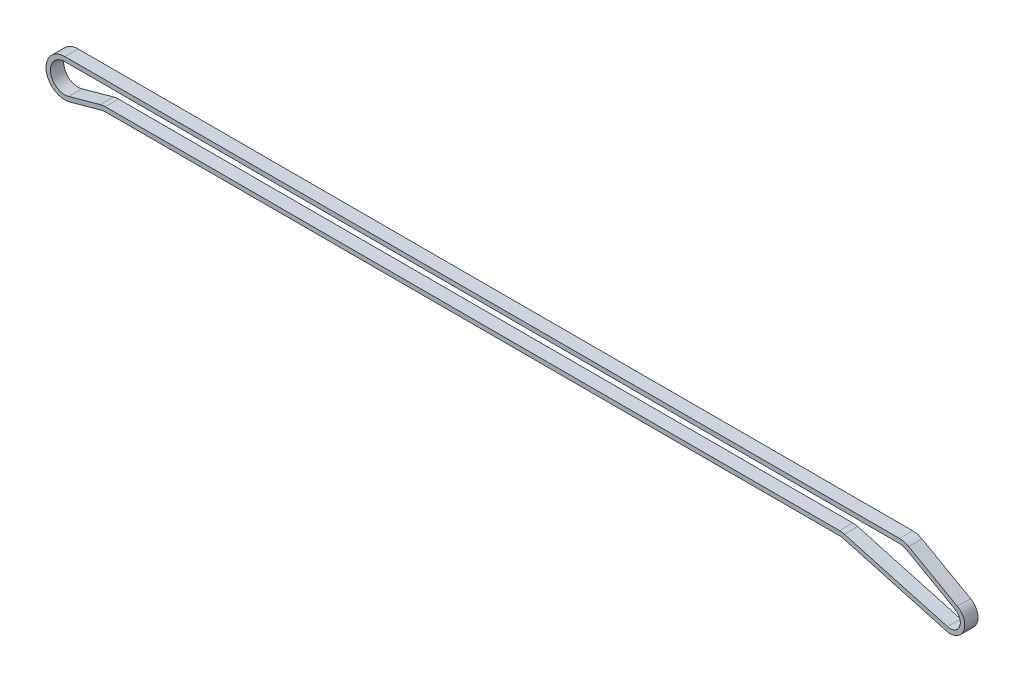
ISO-10303-21;
HEADER;
FILE_DESCRIPTION(('STEP AP214'),'2;1');
FILE_NAME('part.step','',(''),(''),'','','');
FILE_SCHEMA(('AUTOMOTIVE_DESIGN { 1 0 10303 214 1 1 1 1 }'));
ENDSEC;
DATA;
#1=APPLICATION_CONTEXT('core data for automotive mechanical design processes');
#2=APPLICATION_PROTOCOL_DEFINITION('international standard','automotive_design',2000,#1);
#3=PRODUCT_CONTEXT('',#1,'mechanical');
#4=PRODUCT('Part','Part','',(#3));
#5=PRODUCT_RELATED_PRODUCT_CATEGORY('part','',(#4));
#6=PRODUCT_DEFINITION_FORMATION('','',#4);
#7=PRODUCT_DEFINITION_CONTEXT('part definition',#1,'design');
#8=PRODUCT_DEFINITION('design','',#6,#7);
#9=PRODUCT_DEFINITION_SHAPE('','',#8);
#10=(LENGTH_UNIT() NAMED_UNIT(*) SI_UNIT(.MILLI.,.METRE.));
#11=(NAMED_UNIT(*) PLANE_ANGLE_UNIT() SI_UNIT($,.RADIAN.));
#12=(NAMED_UNIT(*) SI_UNIT($,.STERADIAN.) SOLID_ANGLE_UNIT());
#13=UNCERTAINTY_MEASURE_WITH_UNIT(LENGTH_MEASURE(1.E-05),#10,'distance_accuracy_value','');
#14=(GEOMETRIC_REPRESENTATION_CONTEXT(3) GLOBAL_UNCERTAINTY_ASSIGNED_CONTEXT((#13)) GLOBAL_UNIT_ASSIGNED_CONTEXT((#10,
#11,#12)) REPRESENTATION_CONTEXT('',''));
#15=CARTESIAN_POINT('',(0.,0.,0.));
#16=DIRECTION('',(0.,0.,1.));
#17=DIRECTION('',(1.,0.,0.));
#18=AXIS2_PLACEMENT_3D('',#15,#16,#17);
#19=CARTESIAN_POINT('',(-30.444863728675,-2.49999999999809,0.));
#20=DIRECTION('',(0.,0.,1.));
#21=DIRECTION('',(1.,0.,0.));
#22=AXIS2_PLACEMENT_3D('',#19,#20,#21);
#23=CYLINDRICAL_SURFACE('',#22,8.5);
#24=CARTESIAN_POINT('',(-30.444863728675,-2.49999999999809,6.));
#25=DIRECTION('',(0.,0.,1.));
#26=DIRECTION('',(1.,0.,0.));
#27=AXIS2_PLACEMENT_3D('',#24,#25,#26);
#28=CIRCLE('',#27,8.5);
#29=CARTESIAN_POINT('',(-30.444863728675,6.00000000000191,6.));
#30=VERTEX_POINT('',#29);
#31=CARTESIAN_POINT('',(-28.1810923233217,-10.6930054939731,6.));
#32=VERTEX_POINT('',#31);
#33=EDGE_CURVE('E236',#30,#32,#28,.T.);
#34=ORIENTED_EDGE('',*,*,#33,.F.);
#35=DIRECTION('',(0.,0.,1.));
#36=VECTOR('',#35,1.);
#37=CARTESIAN_POINT('',(-30.444863728675,6.00000000000191,0.));
#38=LINE('',#37,#36);
#39=CARTESIAN_POINT('',(-30.444863728675,6.00000000000191,0.));
#40=VERTEX_POINT('',#39);
#41=EDGE_CURVE('E11',#40,#30,#38,.T.);
#42=ORIENTED_EDGE('',*,*,#41,.F.);
#43=CARTESIAN_POINT('',(-30.444863728675,-2.49999999999809,0.));
#44=DIRECTION('',(0.,0.,1.));
#45=DIRECTION('',(1.,0.,0.));
#46=AXIS2_PLACEMENT_3D('',#43,#44,#45);
#47=CIRCLE('',#46,8.5);
#48=CARTESIAN_POINT('',(-28.1810923233217,-10.6930054939731,0.));
#49=VERTEX_POINT('',#48);
#50=EDGE_CURVE('E252',#40,#49,#47,.T.);
#51=ORIENTED_EDGE('',*,*,#50,.T.);
#52=DIRECTION('',(0.,0.,1.));
#53=VECTOR('',#52,1.);
#54=CARTESIAN_POINT('',(-28.1810923233217,-10.6930054939731,0.));
#55=LINE('',#54,#53);
#56=EDGE_CURVE('E33',#49,#32,#55,.T.);
#57=ORIENTED_EDGE('',*,*,#56,.T.);
#58=EDGE_LOOP('',(#34,#42,#51,#57));
#59=FACE_BOUND('',#58,.T.);
#60=ADVANCED_FACE('F30',(#59),#23,.T.);
#61=CARTESIAN_POINT('',(347.150669090667,6.00000000000012,0.));
#62=DIRECTION('',(0.,1.,0.));
#63=DIRECTION('',(-1.,0.,0.));
#64=AXIS2_PLACEMENT_3D('',#61,#62,#63);
#65=PLANE('',#64);
#66=DIRECTION('',(-1.,0.,0.));
#67=VECTOR('',#66,1.);
#68=CARTESIAN_POINT('',(347.150669090667,6.00000000000012,6.));
#69=LINE('',#68,#67);
#70=CARTESIAN_POINT('',(347.150669090667,6.00000000000012,6.));
#71=VERTEX_POINT('',#70);
#72=EDGE_CURVE('E256',#71,#30,#69,.T.);
#73=ORIENTED_EDGE('',*,*,#72,.F.);
#74=DIRECTION('',(0.,0.,1.));
#75=VECTOR('',#74,1.);
#76=CARTESIAN_POINT('',(347.150669090667,6.00000000000012,0.));
#77=LINE('',#76,#75);
#78=CARTESIAN_POINT('',(347.150669090667,6.00000000000012,0.));
#79=VERTEX_POINT('',#78);
#80=EDGE_CURVE('E38',#79,#71,#77,.T.);
#81=ORIENTED_EDGE('',*,*,#80,.F.);
#82=DIRECTION('',(-1.,0.,0.));
#83=VECTOR('',#82,1.);
#84=CARTESIAN_POINT('',(347.150669090667,6.00000000000012,0.));
#85=LINE('',#84,#83);
#86=EDGE_CURVE('E280',#79,#40,#85,.T.);
#87=ORIENTED_EDGE('',*,*,#86,.T.);
#88=ORIENTED_EDGE('',*,*,#41,.T.);
#89=EDGE_LOOP('',(#73,#81,#87,#88));
#90=FACE_BOUND('',#89,.T.);
#91=ADVANCED_FACE('F337',(#90),#65,.T.);
#92=CARTESIAN_POINT('',(347.150669090667,-2.49999999999988,0.));
#93=DIRECTION('',(0.,0.,1.));
#94=DIRECTION('',(1.,0.,0.));
#95=AXIS2_PLACEMENT_3D('',#92,#93,#94);
#96=CYLINDRICAL_SURFACE('',#95,8.50000000000085);
#97=CARTESIAN_POINT('',(347.150669090667,-2.49999999999988,6.));
#98=DIRECTION('',(0.,0.,1.));
#99=DIRECTION('',(1.,0.,0.));
#100=AXIS2_PLACEMENT_3D('',#97,#98,#99);
#101=CIRCLE('',#100,8.50000000000085);
#102=CARTESIAN_POINT('',(351.325657016666,4.90401754575032,6.));
#103=VERTEX_POINT('',#102);
#104=EDGE_CURVE('E306',#103,#71,#101,.T.);
#105=ORIENTED_EDGE('',*,*,#104,.F.);
#106=DIRECTION('',(0.,0.,1.));
#107=VECTOR('',#106,1.);
#108=CARTESIAN_POINT('',(351.325657016666,4.90401754575032,0.));
#109=LINE('',#108,#107);
#110=CARTESIAN_POINT('',(351.325657016666,4.90401754575032,0.));
#111=VERTEX_POINT('',#110);
#112=EDGE_CURVE('E312',#111,#103,#109,.T.);
#113=ORIENTED_EDGE('',*,*,#112,.F.);
#114=CARTESIAN_POINT('',(347.150669090667,-2.49999999999988,0.));
#115=DIRECTION('',(0.,0.,1.));
#116=DIRECTION('',(1.,0.,0.));
#117=AXIS2_PLACEMENT_3D('',#114,#115,#116);
#118=CIRCLE('',#117,8.50000000000085);
#119=EDGE_CURVE('E277',#111,#79,#118,.T.);
#120=ORIENTED_EDGE('',*,*,#119,.T.);
#121=ORIENTED_EDGE('',*,*,#80,.T.);
#122=EDGE_LOOP('',(#105,#113,#120,#121));
#123=FACE_BOUND('',#122,.T.);
#124=ADVANCED_FACE('F364',(#123),#96,.T.);
#125=CARTESIAN_POINT('',(373.327054186709,-7.50216152830783,0.));
#126=DIRECTION('',(0.491175050117533,0.871060887735203,0.));
#127=DIRECTION('',(-0.871060887735203,0.491175050117533,0.));
#128=AXIS2_PLACEMENT_3D('',#125,#126,#127);
#129=PLANE('',#128);
#130=DIRECTION('',(-0.871060887735203,0.491175050117533,0.));
#131=VECTOR('',#130,1.);
#132=CARTESIAN_POINT('',(373.327054186709,-7.50216152830783,6.));
#133=LINE('',#132,#131);
#134=CARTESIAN_POINT('',(373.327054186709,-7.50216152830783,6.));
#135=VERTEX_POINT('',#134);
#136=EDGE_CURVE('E303',#135,#103,#133,.T.);
#137=ORIENTED_EDGE('',*,*,#136,.F.);
#138=DIRECTION('',(0.,0.,1.));
#139=VECTOR('',#138,1.);
#140=CARTESIAN_POINT('',(373.327054186709,-7.50216152830783,0.));
#141=LINE('',#140,#139);
#142=CARTESIAN_POINT('',(373.327054186709,-7.50216152830783,0.));
#143=VERTEX_POINT('',#142);
#144=EDGE_CURVE('E314',#143,#135,#141,.T.);
#145=ORIENTED_EDGE('',*,*,#144,.F.);
#146=DIRECTION('',(-0.871060887735203,0.491175050117533,0.));
#147=VECTOR('',#146,1.);
#148=CARTESIAN_POINT('',(373.327054186709,-7.50216152830783,0.));
#149=LINE('',#148,#147);
#150=EDGE_CURVE('E274',#143,#111,#149,.T.);
#151=ORIENTED_EDGE('',*,*,#150,.T.);
#152=ORIENTED_EDGE('',*,*,#112,.T.);
#153=EDGE_LOOP('',(#137,#145,#151,#152));
#154=FACE_BOUND('',#153,.T.);
#155=ADVANCED_FACE('F362',(#154),#129,.T.);
#156=CARTESIAN_POINT('',(370.085298855935,-13.251163387357,0.));
#157=DIRECTION('',(0.,0.,1.));
#158=DIRECTION('',(1.,0.,0.));
#159=AXIS2_PLACEMENT_3D('',#156,#157,#158);
#160=CYLINDRICAL_SURFACE('',#159,6.59999999999555);
#161=CARTESIAN_POINT('',(370.085298855935,-13.251163387357,6.));
#162=DIRECTION('',(0.,0.,1.));
#163=DIRECTION('',(1.,0.,0.));
#164=AXIS2_PLACEMENT_3D('',#161,#162,#163);
#165=CIRCLE('',#164,6.59999999999555);
#166=CARTESIAN_POINT('',(368.327142631736,-19.6126794559723,6.));
#167=VERTEX_POINT('',#166);
#168=EDGE_CURVE('E300',#167,#135,#165,.T.);
#169=ORIENTED_EDGE('',*,*,#168,.F.);
#170=DIRECTION('',(0.,0.,1.));
#171=VECTOR('',#170,1.);
#172=CARTESIAN_POINT('',(368.327142631736,-19.6126794559723,0.));
#173=LINE('',#172,#171);
#174=CARTESIAN_POINT('',(368.327142631736,-19.6126794559723,0.));
#175=VERTEX_POINT('',#174);
#176=EDGE_CURVE('E316',#175,#167,#173,.T.);
#177=ORIENTED_EDGE('',*,*,#176,.F.);
#178=CARTESIAN_POINT('',(370.085298855935,-13.251163387357,0.));
#179=DIRECTION('',(0.,0.,1.));
#180=DIRECTION('',(1.,0.,0.));
#181=AXIS2_PLACEMENT_3D('',#178,#179,#180);
#182=CIRCLE('',#181,6.59999999999555);
#183=EDGE_CURVE('E271',#175,#143,#182,.T.);
#184=ORIENTED_EDGE('',*,*,#183,.T.);
#185=ORIENTED_EDGE('',*,*,#144,.T.);
#186=EDGE_LOOP('',(#169,#177,#184,#185));
#187=FACE_BOUND('',#186,.T.);
#188=ADVANCED_FACE('F358',(#187),#160,.T.);
#189=CARTESIAN_POINT('',(321.731517493532,-6.73487053847568,0.));
#190=DIRECTION('',(-0.266387306697093,-0.963866071002952,0.));
#191=DIRECTION('',(0.963866071002953,-0.266387306697094,0.));
#192=AXIS2_PLACEMENT_3D('',#189,#190,#191);
#193=PLANE('',#192);
#194=DIRECTION('',(0.963866071002953,-0.266387306697093,0.));
#195=VECTOR('',#194,1.);
#196=CARTESIAN_POINT('',(321.731517493532,-6.73487053847568,6.));
#197=LINE('',#196,#195);
#198=CARTESIAN_POINT('',(321.731517493532,-6.73487053847568,6.));
#199=VERTEX_POINT('',#198);
#200=EDGE_CURVE('E297',#199,#167,#197,.T.);
#201=ORIENTED_EDGE('',*,*,#200,.F.);
#202=DIRECTION('',(0.,0.,1.));
#203=VECTOR('',#202,1.);
#204=CARTESIAN_POINT('',(321.731517493532,-6.73487053847568,0.));
#205=LINE('',#204,#203);
#206=CARTESIAN_POINT('',(321.731517493532,-6.73487053847568,0.));
#207=VERTEX_POINT('',#206);
#208=EDGE_CURVE('E318',#207,#199,#205,.T.);
#209=ORIENTED_EDGE('',*,*,#208,.F.);
#210=DIRECTION('',(0.963866071002953,-0.266387306697093,0.));
#211=VECTOR('',#210,1.);
#212=CARTESIAN_POINT('',(321.731517493532,-6.73487053847568,0.));
#213=LINE('',#212,#211);
#214=EDGE_CURVE('E268',#207,#175,#213,.T.);
#215=ORIENTED_EDGE('',*,*,#214,.T.);
#216=ORIENTED_EDGE('',*,*,#176,.T.);
#217=EDGE_LOOP('',(#201,#209,#215,#216));
#218=FACE_BOUND('',#217,.T.);
#219=ADVANCED_FACE('F354',(#218),#193,.T.);
#220=CARTESIAN_POINT('',(320.,-13.,0.));
#221=DIRECTION('',(0.,0.,1.));
#222=DIRECTION('',(1.,0.,0.));
#223=AXIS2_PLACEMENT_3D('',#220,#221,#222);
#224=CYLINDRICAL_SURFACE('',#223,6.50000000000528);
#225=CARTESIAN_POINT('',(320.,-13.,6.));
#226=DIRECTION('',(0.,0.,-1.));
#227=DIRECTION('',(-1.,0.,0.));
#228=AXIS2_PLACEMENT_3D('',#225,#226,#227);
#229=CIRCLE('',#228,6.50000000000528);
#230=CARTESIAN_POINT('',(320.,-6.49999999999472,6.));
#231=VERTEX_POINT('',#230);
#232=EDGE_CURVE('E294',#231,#199,#229,.T.);
#233=ORIENTED_EDGE('',*,*,#232,.F.);
#234=DIRECTION('',(0.,0.,1.));
#235=VECTOR('',#234,1.);
#236=CARTESIAN_POINT('',(320.,-6.49999999999472,0.));
#237=LINE('',#236,#235);
#238=CARTESIAN_POINT('',(320.,-6.49999999999472,0.));
#239=VERTEX_POINT('',#238);
#240=EDGE_CURVE('E320',#239,#231,#237,.T.);
#241=ORIENTED_EDGE('',*,*,#240,.F.);
#242=CARTESIAN_POINT('',(320.,-13.,0.));
#243=DIRECTION('',(0.,0.,-1.));
#244=DIRECTION('',(-1.,0.,0.));
#245=AXIS2_PLACEMENT_3D('',#242,#243,#244);
#246=CIRCLE('',#245,6.50000000000528);
#247=EDGE_CURVE('E265',#239,#207,#246,.T.);
#248=ORIENTED_EDGE('',*,*,#247,.T.);
#249=ORIENTED_EDGE('',*,*,#208,.T.);
#250=EDGE_LOOP('',(#233,#241,#248,#249));
#251=FACE_BOUND('',#250,.T.);
#252=ADVANCED_FACE('F350',(#251),#224,.F.);
#253=CARTESIAN_POINT('',(-12.1243556529851,-6.4999999999947,0.));
#254=DIRECTION('',(0.,-1.,0.));
#255=DIRECTION('',(0.,0.,-1.));
#256=AXIS2_PLACEMENT_3D('',#253,#254,#255);
#257=PLANE('',#256);
#258=DIRECTION('',(1.,0.,0.));
#259=VECTOR('',#258,1.);
#260=CARTESIAN_POINT('',(-12.1243556529851,-6.4999999999947,6.));
#261=LINE('',#260,#259);
#262=CARTESIAN_POINT('',(-12.1243556529851,-6.4999999999947,6.));
#263=VERTEX_POINT('',#262);
#264=EDGE_CURVE('E291',#263,#231,#261,.T.);
#265=ORIENTED_EDGE('',*,*,#264,.F.);
#266=DIRECTION('',(0.,0.,1.));
#267=VECTOR('',#266,1.);
#268=CARTESIAN_POINT('',(-12.1243556529851,-6.4999999999947,0.));
#269=LINE('',#268,#267);
#270=CARTESIAN_POINT('',(-12.1243556529851,-6.4999999999947,0.));
#271=VERTEX_POINT('',#270);
#272=EDGE_CURVE('E322',#271,#263,#269,.T.);
#273=ORIENTED_EDGE('',*,*,#272,.F.);
#274=DIRECTION('',(1.,0.,0.));
#275=VECTOR('',#274,1.);
#276=CARTESIAN_POINT('',(-12.1243556529851,-6.4999999999947,0.));
#277=LINE('',#276,#275);
#278=EDGE_CURVE('E262',#271,#239,#277,.T.);
#279=ORIENTED_EDGE('',*,*,#278,.T.);
#280=ORIENTED_EDGE('',*,*,#240,.T.);
#281=EDGE_LOOP('',(#265,#273,#279,#280));
#282=FACE_BOUND('',#281,.T.);
#283=ADVANCED_FACE('F348',(#282),#257,.T.);
#284=CARTESIAN_POINT('',(-12.1243556529851,-12.9999999999947,0.));
#285=DIRECTION('',(0.,0.,1.));
#286=DIRECTION('',(1.,0.,0.));
#287=AXIS2_PLACEMENT_3D('',#284,#285,#286);
#288=CYLINDRICAL_SURFACE('',#287,6.5);
#289=CARTESIAN_POINT('',(-12.1243556529851,-12.9999999999947,6.));
#290=DIRECTION('',(0.,0.,-1.));
#291=DIRECTION('',(-1.,0.,0.));
#292=AXIS2_PLACEMENT_3D('',#289,#290,#291);
#293=CIRCLE('',#292,6.5);
#294=CARTESIAN_POINT('',(-13.8554749629612,-6.73476050460203,6.));
#295=VERTEX_POINT('',#294);
#296=EDGE_CURVE('E288',#295,#263,#293,.T.);
#297=ORIENTED_EDGE('',*,*,#296,.F.);
#298=DIRECTION('',(0.,0.,1.));
#299=VECTOR('',#298,1.);
#300=CARTESIAN_POINT('',(-13.8554749629612,-6.73476050460203,0.));
#301=LINE('',#300,#299);
#302=CARTESIAN_POINT('',(-13.8554749629612,-6.73476050460203,0.));
#303=VERTEX_POINT('',#302);
#304=EDGE_CURVE('E323',#303,#295,#301,.T.);
#305=ORIENTED_EDGE('',*,*,#304,.F.);
#306=CARTESIAN_POINT('',(-12.1243556529851,-12.9999999999947,0.));
#307=DIRECTION('',(0.,0.,-1.));
#308=DIRECTION('',(-1.,0.,0.));
#309=AXIS2_PLACEMENT_3D('',#306,#307,#308);
#310=CIRCLE('',#309,6.5);
#311=EDGE_CURVE('E259',#303,#271,#310,.T.);
#312=ORIENTED_EDGE('',*,*,#311,.T.);
#313=ORIENTED_EDGE('',*,*,#272,.T.);
#314=EDGE_LOOP('',(#297,#305,#312,#313));
#315=FACE_BOUND('',#314,.T.);
#316=ADVANCED_FACE('F344',(#315),#288,.F.);
#317=CARTESIAN_POINT('',(-28.1810923233217,-10.6930054939731,0.));
#318=DIRECTION('',(0.266326047688618,-0.963882999291179,0.));
#319=DIRECTION('',(0.963882999291179,0.266326047688618,0.));
#320=AXIS2_PLACEMENT_3D('',#317,#318,#319);
#321=PLANE('',#320);
#322=DIRECTION('',(0.963882999291179,0.266326047688618,0.));
#323=VECTOR('',#322,1.);
#324=CARTESIAN_POINT('',(-28.1810923233217,-10.6930054939731,6.));
#325=LINE('',#324,#323);
#326=EDGE_CURVE('E285',#32,#295,#325,.T.);
#327=ORIENTED_EDGE('',*,*,#326,.F.);
#328=ORIENTED_EDGE('',*,*,#56,.F.);
#329=DIRECTION('',(0.963882999291179,0.266326047688618,0.));
#330=VECTOR('',#329,1.);
#331=CARTESIAN_POINT('',(-28.1810923233217,-10.6930054939731,0.));
#332=LINE('',#331,#330);
#333=EDGE_CURVE('E255',#49,#303,#332,.T.);
#334=ORIENTED_EDGE('',*,*,#333,.T.);
#335=ORIENTED_EDGE('',*,*,#304,.T.);
#336=EDGE_LOOP('',(#327,#328,#334,#335));
#337=FACE_BOUND('',#336,.T.);
#338=ADVANCED_FACE('F331',(#337),#321,.T.);
#339=CARTESIAN_POINT('',(-30.444863728675,-2.49999999999809,0.));
#340=DIRECTION('',(0.,0.,1.));
#341=DIRECTION('',(1.,0.,0.));
#342=AXIS2_PLACEMENT_3D('',#339,#340,#341);
#343=PLANE('',#342);
#344=DIRECTION('',(-0.871060887735306,0.491175050117349,0.));
#345=VECTOR('',#344,1.);
#346=CARTESIAN_POINT('',(350.343306916429,3.1618957702796,0.));
#347=LINE('',#346,#345);
#348=CARTESIAN_POINT('',(372.344704086475,-9.24428330377463,0.));
#349=VERTEX_POINT('',#348);
#350=CARTESIAN_POINT('',(350.343306916429,3.1618957702796,0.));
#351=VERTEX_POINT('',#350);
#352=EDGE_CURVE('E175',#349,#351,#347,.T.);
#353=ORIENTED_EDGE('',*,*,#352,.T.);
#354=CARTESIAN_POINT('',(347.150669090667,-2.49999999999988,0.));
#355=DIRECTION('',(0.,0.,1.));
#356=DIRECTION('',(-1.,0.,0.));
#357=AXIS2_PLACEMENT_3D('',#354,#355,#356);
#358=CIRCLE('',#357,6.49999999999998);
#359=CARTESIAN_POINT('',(347.150669090667,4.00000000000007,0.));
#360=VERTEX_POINT('',#359);
#361=EDGE_CURVE('E169',#351,#360,#358,.T.);
#362=ORIENTED_EDGE('',*,*,#361,.T.);
#363=DIRECTION('',(-1.,0.,0.));
#364=VECTOR('',#363,1.);
#365=CARTESIAN_POINT('',(-30.4448637286749,4.00000000000018,0.));
#366=LINE('',#365,#364);
#367=CARTESIAN_POINT('',(-30.4448637286749,4.00000000000018,0.));
#368=VERTEX_POINT('',#367);
#369=EDGE_CURVE('E178',#360,#368,#366,.T.);
#370=ORIENTED_EDGE('',*,*,#369,.T.);
#371=CARTESIAN_POINT('',(-30.444863728675,-2.49999999999809,0.));
#372=DIRECTION('',(0.,0.,1.));
#373=DIRECTION('',(-1.,0.,0.));
#374=AXIS2_PLACEMENT_3D('',#371,#372,#373);
#375=CIRCLE('',#374,6.49999999999914);
#376=CARTESIAN_POINT('',(-28.7137444187012,-8.76523949539138,0.));
#377=VERTEX_POINT('',#376);
#378=EDGE_CURVE('E46',#368,#377,#375,.T.);
#379=ORIENTED_EDGE('',*,*,#378,.T.);
#380=DIRECTION('',(0.963882999291276,0.266326047688271,0.));
#381=VECTOR('',#380,1.);
#382=CARTESIAN_POINT('',(-14.388127058334,-4.80699450602403,0.));
#383=LINE('',#382,#381);
#384=CARTESIAN_POINT('',(-14.388127058334,-4.80699450602403,0.));
#385=VERTEX_POINT('',#384);
#386=EDGE_CURVE('E193',#377,#385,#383,.T.);
#387=ORIENTED_EDGE('',*,*,#386,.T.);
#388=CARTESIAN_POINT('',(-12.1243556529851,-12.9999999999947,0.));
#389=DIRECTION('',(0.,0.,-1.));
#390=DIRECTION('',(1.,0.,0.));
#391=AXIS2_PLACEMENT_3D('',#388,#389,#390);
#392=CIRCLE('',#391,8.49999999999465);
#393=CARTESIAN_POINT('',(-12.1243556529851,-4.50000000000006,0.));
#394=VERTEX_POINT('',#393);
#395=EDGE_CURVE('E196',#385,#394,#392,.T.);
#396=ORIENTED_EDGE('',*,*,#395,.T.);
#397=DIRECTION('',(1.,0.,0.));
#398=VECTOR('',#397,1.);
#399=CARTESIAN_POINT('',(320.,-4.5,0.));
#400=LINE('',#399,#398);
#401=CARTESIAN_POINT('',(320.,-4.5,0.));
#402=VERTEX_POINT('',#401);
#403=EDGE_CURVE('E199',#394,#402,#400,.T.);
#404=ORIENTED_EDGE('',*,*,#403,.T.);
#405=CARTESIAN_POINT('',(320.,-13.,0.));
#406=DIRECTION('',(0.,0.,-1.));
#407=DIRECTION('',(1.,0.,0.));
#408=AXIS2_PLACEMENT_3D('',#405,#406,#407);
#409=CIRCLE('',#408,8.50000000000001);
#410=CARTESIAN_POINT('',(322.264292106925,-4.8071383964749,0.));
#411=VERTEX_POINT('',#410);
#412=EDGE_CURVE('E202',#402,#411,#409,.T.);
#413=ORIENTED_EDGE('',*,*,#412,.T.);
#414=DIRECTION('',(0.963866071002952,-0.266387306697094,0.));
#415=VECTOR('',#414,1.);
#416=CARTESIAN_POINT('',(368.859917245129,-17.6849473139706,0.));
#417=LINE('',#416,#415);
#418=CARTESIAN_POINT('',(368.859917245129,-17.6849473139706,0.));
#419=VERTEX_POINT('',#418);
#420=EDGE_CURVE('E205',#411,#419,#417,.T.);
#421=ORIENTED_EDGE('',*,*,#420,.T.);
#422=CARTESIAN_POINT('',(370.085298855935,-13.251163387357,0.));
#423=DIRECTION('',(0.,0.,1.));
#424=DIRECTION('',(-1.,0.,0.));
#425=AXIS2_PLACEMENT_3D('',#422,#423,#424);
#426=CIRCLE('',#425,4.6);
#427=EDGE_CURVE('E208',#419,#349,#426,.T.);
#428=ORIENTED_EDGE('',*,*,#427,.T.);
#429=EDGE_LOOP('',(#353,#362,#370,#379,#387,#396,#404,#413,#421,#428));
#430=FACE_BOUND('',#429,.T.);
#431=ORIENTED_EDGE('',*,*,#50,.F.);
#432=ORIENTED_EDGE('',*,*,#86,.F.);
#433=ORIENTED_EDGE('',*,*,#119,.F.);
#434=ORIENTED_EDGE('',*,*,#150,.F.);
#435=ORIENTED_EDGE('',*,*,#183,.F.);
#436=ORIENTED_EDGE('',*,*,#214,.F.);
#437=ORIENTED_EDGE('',*,*,#247,.F.);
#438=ORIENTED_EDGE('',*,*,#278,.F.);
#439=ORIENTED_EDGE('',*,*,#311,.F.);
#440=ORIENTED_EDGE('',*,*,#333,.F.);
#441=EDGE_LOOP('',(#431,#432,#433,#434,#435,#436,#437,#438,#439,#440));
#442=FACE_BOUND('',#441,.T.);
#443=ADVANCED_FACE('F182',(#430,#442),#343,.F.);
#444=CARTESIAN_POINT('',(-30.444863728675,-2.49999999999809,6.));
#445=DIRECTION('',(0.,0.,1.));
#446=DIRECTION('',(1.,0.,0.));
#447=AXIS2_PLACEMENT_3D('',#444,#445,#446);
#448=PLANE('',#447);
#449=CARTESIAN_POINT('',(347.150669090667,-2.49999999999988,6.));
#450=DIRECTION('',(0.,0.,1.));
#451=DIRECTION('',(-1.,0.,0.));
#452=AXIS2_PLACEMENT_3D('',#449,#450,#451);
#453=CIRCLE('',#452,6.49999999999998);
#454=CARTESIAN_POINT('',(350.343306916429,3.1618957702796,6.));
#455=VERTEX_POINT('',#454);
#456=CARTESIAN_POINT('',(347.150669090667,4.00000000000007,6.));
#457=VERTEX_POINT('',#456);
#458=EDGE_CURVE('E54',#455,#457,#453,.T.);
#459=ORIENTED_EDGE('',*,*,#458,.F.);
#460=DIRECTION('',(-0.871060887735306,0.491175050117349,0.));
#461=VECTOR('',#460,1.);
#462=CARTESIAN_POINT('',(350.343306916429,3.1618957702796,6.));
#463=LINE('',#462,#461);
#464=CARTESIAN_POINT('',(372.344704086475,-9.24428330377463,6.));
#465=VERTEX_POINT('',#464);
#466=EDGE_CURVE('E186',#465,#455,#463,.T.);
#467=ORIENTED_EDGE('',*,*,#466,.F.);
#468=CARTESIAN_POINT('',(370.085298855935,-13.251163387357,6.));
#469=DIRECTION('',(0.,0.,1.));
#470=DIRECTION('',(-1.,0.,0.));
#471=AXIS2_PLACEMENT_3D('',#468,#469,#470);
#472=CIRCLE('',#471,4.6);
#473=CARTESIAN_POINT('',(368.859917245129,-17.6849473139706,6.));
#474=VERTEX_POINT('',#473);
#475=EDGE_CURVE('E189',#474,#465,#472,.T.);
#476=ORIENTED_EDGE('',*,*,#475,.F.);
#477=DIRECTION('',(0.963866071002952,-0.266387306697094,0.));
#478=VECTOR('',#477,1.);
#479=CARTESIAN_POINT('',(368.859917245129,-17.6849473139706,6.));
#480=LINE('',#479,#478);
#481=CARTESIAN_POINT('',(322.264292106925,-4.8071383964749,6.));
#482=VERTEX_POINT('',#481);
#483=EDGE_CURVE('E229',#482,#474,#480,.T.);
#484=ORIENTED_EDGE('',*,*,#483,.F.);
#485=CARTESIAN_POINT('',(320.,-13.,6.));
#486=DIRECTION('',(0.,0.,-1.));
#487=DIRECTION('',(1.,0.,0.));
#488=AXIS2_PLACEMENT_3D('',#485,#486,#487);
#489=CIRCLE('',#488,8.50000000000001);
#490=CARTESIAN_POINT('',(320.,-4.5,6.));
#491=VERTEX_POINT('',#490);
#492=EDGE_CURVE('E226',#491,#482,#489,.T.);
#493=ORIENTED_EDGE('',*,*,#492,.F.);
#494=DIRECTION('',(1.,0.,0.));
#495=VECTOR('',#494,1.);
#496=CARTESIAN_POINT('',(320.,-4.5,6.));
#497=LINE('',#496,#495);
#498=CARTESIAN_POINT('',(-12.1243556529851,-4.50000000000006,6.));
#499=VERTEX_POINT('',#498);
#500=EDGE_CURVE('E223',#499,#491,#497,.T.);
#501=ORIENTED_EDGE('',*,*,#500,.F.);
#502=CARTESIAN_POINT('',(-12.1243556529851,-12.9999999999947,6.));
#503=DIRECTION('',(0.,0.,-1.));
#504=DIRECTION('',(1.,0.,0.));
#505=AXIS2_PLACEMENT_3D('',#502,#503,#504);
#506=CIRCLE('',#505,8.49999999999465);
#507=CARTESIAN_POINT('',(-14.388127058334,-4.80699450602403,6.));
#508=VERTEX_POINT('',#507);
#509=EDGE_CURVE('E220',#508,#499,#506,.T.);
#510=ORIENTED_EDGE('',*,*,#509,.F.);
#511=DIRECTION('',(0.963882999291276,0.266326047688271,0.));
#512=VECTOR('',#511,1.);
#513=CARTESIAN_POINT('',(-14.388127058334,-4.80699450602403,6.));
#514=LINE('',#513,#512);
#515=CARTESIAN_POINT('',(-28.7137444187012,-8.76523949539138,6.));
#516=VERTEX_POINT('',#515);
#517=EDGE_CURVE('E217',#516,#508,#514,.T.);
#518=ORIENTED_EDGE('',*,*,#517,.F.);
#519=CARTESIAN_POINT('',(-30.444863728675,-2.49999999999809,6.));
#520=DIRECTION('',(0.,0.,1.));
#521=DIRECTION('',(-1.,0.,0.));
#522=AXIS2_PLACEMENT_3D('',#519,#520,#521);
#523=CIRCLE('',#522,6.49999999999914);
#524=CARTESIAN_POINT('',(-30.4448637286749,4.00000000000105,6.));
#525=VERTEX_POINT('',#524);
#526=EDGE_CURVE('E214',#525,#516,#523,.T.);
#527=ORIENTED_EDGE('',*,*,#526,.F.);
#528=DIRECTION('',(-1.,0.,0.));
#529=VECTOR('',#528,1.);
#530=CARTESIAN_POINT('',(-30.4448637286749,4.00000000000018,6.));
#531=LINE('',#530,#529);
#532=EDGE_CURVE('E212',#457,#525,#531,.T.);
#533=ORIENTED_EDGE('',*,*,#532,.F.);
#534=EDGE_LOOP('',(#459,#467,#476,#484,#493,#501,#510,#518,#527,#533));
#535=FACE_BOUND('',#534,.T.);
#536=ORIENTED_EDGE('',*,*,#33,.T.);
#537=ORIENTED_EDGE('',*,*,#326,.T.);
#538=ORIENTED_EDGE('',*,*,#296,.T.);
#539=ORIENTED_EDGE('',*,*,#264,.T.);
#540=ORIENTED_EDGE('',*,*,#232,.T.);
#541=ORIENTED_EDGE('',*,*,#200,.T.);
#542=ORIENTED_EDGE('',*,*,#168,.T.);
#543=ORIENTED_EDGE('',*,*,#136,.T.);
#544=ORIENTED_EDGE('',*,*,#104,.T.);
#545=ORIENTED_EDGE('',*,*,#72,.T.);
#546=EDGE_LOOP('',(#536,#537,#538,#539,#540,#541,#542,#543,#544,#545));
#547=FACE_BOUND('',#546,.T.);
#548=ADVANCED_FACE('F333',(#535,#547),#448,.T.);
#549=CARTESIAN_POINT('',(347.150669090667,-2.49999999999988,0.));
#550=DIRECTION('',(0.,0.,1.));
#551=DIRECTION('',(1.,0.,0.));
#552=AXIS2_PLACEMENT_3D('',#549,#550,#551);
#553=CYLINDRICAL_SURFACE('',#552,6.49999999999998);
#554=ORIENTED_EDGE('',*,*,#458,.T.);
#555=DIRECTION('',(0.,0.,1.));
#556=VECTOR('',#555,1.);
#557=CARTESIAN_POINT('',(347.150669090667,4.00000000000007,0.));
#558=LINE('',#557,#556);
#559=EDGE_CURVE('E165',#360,#457,#558,.T.);
#560=ORIENTED_EDGE('',*,*,#559,.F.);
#561=ORIENTED_EDGE('',*,*,#361,.F.);
#562=DIRECTION('',(0.,0.,1.));
#563=VECTOR('',#562,1.);
#564=CARTESIAN_POINT('',(350.343306916429,3.1618957702796,0.));
#565=LINE('',#564,#563);
#566=EDGE_CURVE('E234',#351,#455,#565,.T.);
#567=ORIENTED_EDGE('',*,*,#566,.T.);
#568=EDGE_LOOP('',(#554,#560,#561,#567));
#569=FACE_BOUND('',#568,.T.);
#570=ADVANCED_FACE('F167',(#569),#553,.F.);
#571=CARTESIAN_POINT('',(350.343306916429,3.1618957702796,0.));
#572=DIRECTION('',(0.491175050117349,0.871060887735306,0.));
#573=DIRECTION('',(-0.871060887735306,0.491175050117349,0.));
#574=AXIS2_PLACEMENT_3D('',#571,#572,#573);
#575=PLANE('',#574);
#576=ORIENTED_EDGE('',*,*,#466,.T.);
#577=ORIENTED_EDGE('',*,*,#566,.F.);
#578=ORIENTED_EDGE('',*,*,#352,.F.);
#579=DIRECTION('',(0.,0.,1.));
#580=VECTOR('',#579,1.);
#581=CARTESIAN_POINT('',(372.344704086475,-9.24428330377463,0.));
#582=LINE('',#581,#580);
#583=EDGE_CURVE('E237',#349,#465,#582,.T.);
#584=ORIENTED_EDGE('',*,*,#583,.T.);
#585=EDGE_LOOP('',(#576,#577,#578,#584));
#586=FACE_BOUND('',#585,.T.);
#587=ADVANCED_FACE('F463',(#586),#575,.F.);
#588=CARTESIAN_POINT('',(370.085298855935,-13.251163387357,0.));
#589=DIRECTION('',(0.,0.,1.));
#590=DIRECTION('',(1.,0.,0.));
#591=AXIS2_PLACEMENT_3D('',#588,#589,#590);
#592=CYLINDRICAL_SURFACE('',#591,4.6);
#593=ORIENTED_EDGE('',*,*,#475,.T.);
#594=ORIENTED_EDGE('',*,*,#583,.F.);
#595=ORIENTED_EDGE('',*,*,#427,.F.);
#596=DIRECTION('',(0.,0.,1.));
#597=VECTOR('',#596,1.);
#598=CARTESIAN_POINT('',(368.859917245129,-17.6849473139706,0.));
#599=LINE('',#598,#597);
#600=EDGE_CURVE('E239',#419,#474,#599,.T.);
#601=ORIENTED_EDGE('',*,*,#600,.T.);
#602=EDGE_LOOP('',(#593,#594,#595,#601));
#603=FACE_BOUND('',#602,.T.);
#604=ADVANCED_FACE('F472',(#603),#592,.F.);
#605=CARTESIAN_POINT('',(368.859917245129,-17.6849473139706,0.));
#606=DIRECTION('',(-0.266387306697094,-0.963866071002952,0.));
#607=DIRECTION('',(0.963866071002953,-0.266387306697094,0.));
#608=AXIS2_PLACEMENT_3D('',#605,#606,#607);
#609=PLANE('',#608);
#610=ORIENTED_EDGE('',*,*,#483,.T.);
#611=ORIENTED_EDGE('',*,*,#600,.F.);
#612=ORIENTED_EDGE('',*,*,#420,.F.);
#613=DIRECTION('',(0.,0.,1.));
#614=VECTOR('',#613,1.);
#615=CARTESIAN_POINT('',(322.264292106925,-4.8071383964749,0.));
#616=LINE('',#615,#614);
#617=EDGE_CURVE('E241',#411,#482,#616,.T.);
#618=ORIENTED_EDGE('',*,*,#617,.T.);
#619=EDGE_LOOP('',(#610,#611,#612,#618));
#620=FACE_BOUND('',#619,.T.);
#621=ADVANCED_FACE('F482',(#620),#609,.F.);
#622=CARTESIAN_POINT('',(320.,-13.,0.));
#623=DIRECTION('',(0.,0.,1.));
#624=DIRECTION('',(1.,0.,0.));
#625=AXIS2_PLACEMENT_3D('',#622,#623,#624);
#626=CYLINDRICAL_SURFACE('',#625,8.50000000000001);
#627=ORIENTED_EDGE('',*,*,#492,.T.);
#628=ORIENTED_EDGE('',*,*,#617,.F.);
#629=ORIENTED_EDGE('',*,*,#412,.F.);
#630=DIRECTION('',(0.,0.,1.));
#631=VECTOR('',#630,1.);
#632=CARTESIAN_POINT('',(320.,-4.5,0.));
#633=LINE('',#632,#631);
#634=EDGE_CURVE('E243',#402,#491,#633,.T.);
#635=ORIENTED_EDGE('',*,*,#634,.T.);
#636=EDGE_LOOP('',(#627,#628,#629,#635));
#637=FACE_BOUND('',#636,.T.);
#638=ADVANCED_FACE('F492',(#637),#626,.T.);
#639=CARTESIAN_POINT('',(320.,-4.5,0.));
#640=DIRECTION('',(0.,-1.,0.));
#641=DIRECTION('',(1.,0.,0.));
#642=AXIS2_PLACEMENT_3D('',#639,#640,#641);
#643=PLANE('',#642);
#644=ORIENTED_EDGE('',*,*,#500,.T.);
#645=ORIENTED_EDGE('',*,*,#634,.F.);
#646=ORIENTED_EDGE('',*,*,#403,.F.);
#647=DIRECTION('',(0.,0.,1.));
#648=VECTOR('',#647,1.);
#649=CARTESIAN_POINT('',(-12.1243556529851,-4.50000000000006,0.));
#650=LINE('',#649,#648);
#651=EDGE_CURVE('E245',#394,#499,#650,.T.);
#652=ORIENTED_EDGE('',*,*,#651,.T.);
#653=EDGE_LOOP('',(#644,#645,#646,#652));
#654=FACE_BOUND('',#653,.T.);
#655=ADVANCED_FACE('F502',(#654),#643,.F.);
#656=CARTESIAN_POINT('',(-12.1243556529851,-12.9999999999947,0.));
#657=DIRECTION('',(0.,0.,1.));
#658=DIRECTION('',(1.,0.,0.));
#659=AXIS2_PLACEMENT_3D('',#656,#657,#658);
#660=CYLINDRICAL_SURFACE('',#659,8.49999999999465);
#661=ORIENTED_EDGE('',*,*,#509,.T.);
#662=ORIENTED_EDGE('',*,*,#651,.F.);
#663=ORIENTED_EDGE('',*,*,#395,.F.);
#664=DIRECTION('',(0.,0.,1.));
#665=VECTOR('',#664,1.);
#666=CARTESIAN_POINT('',(-14.388127058334,-4.80699450602403,0.));
#667=LINE('',#666,#665);
#668=EDGE_CURVE('E247',#385,#508,#667,.T.);
#669=ORIENTED_EDGE('',*,*,#668,.T.);
#670=EDGE_LOOP('',(#661,#662,#663,#669));
#671=FACE_BOUND('',#670,.T.);
#672=ADVANCED_FACE('F512',(#671),#660,.T.);
#673=CARTESIAN_POINT('',(-14.388127058334,-4.80699450602403,0.));
#674=DIRECTION('',(0.266326047688271,-0.963882999291275,0.));
#675=DIRECTION('',(0.963882999291275,0.266326047688271,0.));
#676=AXIS2_PLACEMENT_3D('',#673,#674,#675);
#677=PLANE('',#676);
#678=ORIENTED_EDGE('',*,*,#517,.T.);
#679=ORIENTED_EDGE('',*,*,#668,.F.);
#680=ORIENTED_EDGE('',*,*,#386,.F.);
#681=DIRECTION('',(0.,0.,1.));
#682=VECTOR('',#681,1.);
#683=CARTESIAN_POINT('',(-28.7137444187012,-8.76523949539138,0.));
#684=LINE('',#683,#682);
#685=EDGE_CURVE('E249',#377,#516,#684,.T.);
#686=ORIENTED_EDGE('',*,*,#685,.T.);
#687=EDGE_LOOP('',(#678,#679,#680,#686));
#688=FACE_BOUND('',#687,.T.);
#689=ADVANCED_FACE('F522',(#688),#677,.F.);
#690=CARTESIAN_POINT('',(-30.444863728675,-2.49999999999809,0.));
#691=DIRECTION('',(0.,0.,1.));
#692=DIRECTION('',(1.,0.,0.));
#693=AXIS2_PLACEMENT_3D('',#690,#691,#692);
#694=CYLINDRICAL_SURFACE('',#693,6.49999999999914);
#695=ORIENTED_EDGE('',*,*,#526,.T.);
#696=ORIENTED_EDGE('',*,*,#685,.F.);
#697=ORIENTED_EDGE('',*,*,#378,.F.);
#698=DIRECTION('',(0.,0.,1.));
#699=VECTOR('',#698,1.);
#700=CARTESIAN_POINT('',(-30.4448637286749,4.00000000000105,0.));
#701=LINE('',#700,#699);
#702=EDGE_CURVE('E174',#368,#525,#701,.T.);
#703=ORIENTED_EDGE('',*,*,#702,.T.);
#704=EDGE_LOOP('',(#695,#696,#697,#703));
#705=FACE_BOUND('',#704,.T.);
#706=ADVANCED_FACE('F532',(#705),#694,.F.);
#707=CARTESIAN_POINT('',(-30.4448637286749,4.00000000000018,0.));
#708=DIRECTION('',(0.,1.,0.));
#709=DIRECTION('',(-1.,0.,0.));
#710=AXIS2_PLACEMENT_3D('',#707,#708,#709);
#711=PLANE('',#710);
#712=ORIENTED_EDGE('',*,*,#532,.T.);
#713=ORIENTED_EDGE('',*,*,#702,.F.);
#714=ORIENTED_EDGE('',*,*,#369,.F.);
#715=ORIENTED_EDGE('',*,*,#559,.T.);
#716=EDGE_LOOP('',(#712,#713,#714,#715));
#717=FACE_BOUND('',#716,.T.);
#718=ADVANCED_FACE('F179',(#717),#711,.F.);
#719=CLOSED_SHELL('',(#60,#91,#124,#155,#188,#219,#252,#283,#316,#338,#443,#548,#570,#587,#604,
#621,#638,#655,#672,#689,#706,#718));
#720=MANIFOLD_SOLID_BREP('B2',#719);
#721=ADVANCED_BREP_SHAPE_REPRESENTATION('',(#18,#720),#14);
#722=SHAPE_DEFINITION_REPRESENTATION(#9,#721);
ENDSEC;
END-ISO-10303-21;
